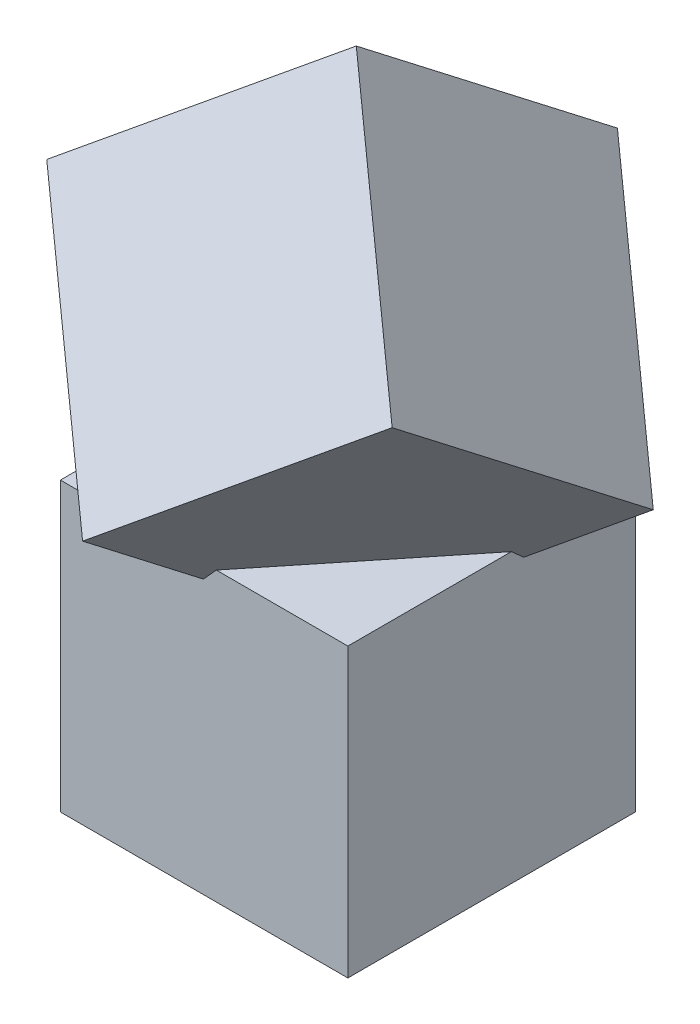
ISO-10303-21;
HEADER;
FILE_DESCRIPTION(('STEP AP214'),'2;1');
FILE_NAME('part.step','',(''),(''),'','','');
FILE_SCHEMA(('AUTOMOTIVE_DESIGN { 1 0 10303 214 1 1 1 1 }'));
ENDSEC;
DATA;
#1=APPLICATION_CONTEXT('core data for automotive mechanical design processes');
#2=APPLICATION_PROTOCOL_DEFINITION('international standard','automotive_design',2000,#1);
#3=PRODUCT_CONTEXT('',#1,'mechanical');
#4=PRODUCT('Part','Part','',(#3));
#5=PRODUCT_RELATED_PRODUCT_CATEGORY('part','',(#4));
#6=PRODUCT_DEFINITION_FORMATION('','',#4);
#7=PRODUCT_DEFINITION_CONTEXT('part definition',#1,'design');
#8=PRODUCT_DEFINITION('design','',#6,#7);
#9=PRODUCT_DEFINITION_SHAPE('','',#8);
#10=(LENGTH_UNIT() NAMED_UNIT(*) SI_UNIT(.MILLI.,.METRE.));
#11=(NAMED_UNIT(*) PLANE_ANGLE_UNIT() SI_UNIT($,.RADIAN.));
#12=(NAMED_UNIT(*) SI_UNIT($,.STERADIAN.) SOLID_ANGLE_UNIT());
#13=UNCERTAINTY_MEASURE_WITH_UNIT(LENGTH_MEASURE(1.E-05),#10,'distance_accuracy_value','');
#14=(GEOMETRIC_REPRESENTATION_CONTEXT(3) GLOBAL_UNCERTAINTY_ASSIGNED_CONTEXT((#13)) GLOBAL_UNIT_ASSIGNED_CONTEXT((#10,
#11,#12)) REPRESENTATION_CONTEXT('',''));
#15=CARTESIAN_POINT('',(0.,0.,0.));
#16=DIRECTION('',(0.,0.,1.));
#17=DIRECTION('',(1.,0.,0.));
#18=AXIS2_PLACEMENT_3D('',#15,#16,#17);
#19=CARTESIAN_POINT('',(-52.6474599966629,137.058153972992,27.1666080296527));
#20=DIRECTION('',(0.762318309311266,0.565679745040778,-0.314447485821422));
#21=DIRECTION('',(0.109672076993213,-0.591737574959713,-0.798635510047476));
#22=AXIS2_PLACEMENT_3D('',#19,#20,#21);
#23=PLANE('',#22);
#24=DIRECTION('',(-0.109672076993213,0.591737574959713,0.798635510047476));
#25=VECTOR('',#24,1.);
#26=CARTESIAN_POINT('',(-4.04387487613971,93.2943327200122,66.2672405407675));
#27=LINE('',#26,#25);
#28=CARTESIAN_POINT('',(4.31313739074309,48.203929508082,5.41121467514981));
#29=VERTEX_POINT('',#28);
#30=CARTESIAN_POINT('',(-4.04387487613971,93.2943327200122,66.2672405407675));
#31=VERTEX_POINT('',#30);
#32=EDGE_CURVE('E116',#29,#31,#27,.T.);
#33=ORIENTED_EDGE('',*,*,#32,.T.);
#34=DIRECTION('',(0.637842324416315,-0.574328362900004,0.51313166025085));
#35=VECTOR('',#34,1.);
#36=CARTESIAN_POINT('',(-52.6474599966629,137.058153972992,27.1666080296527));
#37=LINE('',#36,#35);
#38=CARTESIAN_POINT('',(-52.6474599966629,137.058153972992,27.1666080296527));
#39=VERTEX_POINT('',#38);
#40=EDGE_CURVE('E12',#39,#31,#37,.T.);
#41=ORIENTED_EDGE('',*,*,#40,.F.);
#42=DIRECTION('',(-0.109672076993213,0.591737574959713,0.798635510047476));
#43=VECTOR('',#42,1.);
#44=CARTESIAN_POINT('',(-52.6474599966629,137.058153972992,27.1666080296527));
#45=LINE('',#44,#43);
#46=CARTESIAN_POINT('',(-44.2904477297801,91.9677507610623,-33.689417835965));
#47=VERTEX_POINT('',#46);
#48=EDGE_CURVE('E104',#47,#39,#45,.T.);
#49=ORIENTED_EDGE('',*,*,#48,.F.);
#50=DIRECTION('',(0.637842324416315,-0.574328362900004,0.51313166025085));
#51=VECTOR('',#50,1.);
#52=CARTESIAN_POINT('',(-44.2904477297801,91.9677507610623,-33.689417835965));
#53=LINE('',#52,#51);
#54=EDGE_CURVE('E112',#47,#29,#53,.T.);
#55=ORIENTED_EDGE('',*,*,#54,.T.);
#56=EDGE_LOOP('',(#33,#41,#49,#55));
#57=FACE_BOUND('',#56,.T.);
#58=ADVANCED_FACE('F53',(#57),#23,.F.);
#59=CARTESIAN_POINT('',(-52.6474599966629,137.058153972992,27.1666080296527));
#60=DIRECTION('',(0.109672076993213,-0.591737574959713,-0.798635510047476));
#61=DIRECTION('',(-0.762318309311266,-0.565679745040778,0.314447485821422));
#62=AXIS2_PLACEMENT_3D('',#59,#60,#61);
#63=PLANE('',#62);
#64=DIRECTION('',(0.762318309311266,0.565679745040778,-0.314447485821422));
#65=VECTOR('',#64,1.);
#66=CARTESIAN_POINT('',(-4.04387487613971,93.2943327200122,66.2672405407675));
#67=LINE('',#66,#65);
#68=CARTESIAN_POINT('',(54.0447802933788,136.399129292119,42.3063421211752));
#69=VERTEX_POINT('',#68);
#70=EDGE_CURVE('E108',#31,#69,#67,.T.);
#71=ORIENTED_EDGE('',*,*,#70,.T.);
#72=DIRECTION('',(0.637842324416315,-0.574328362900004,0.51313166025085));
#73=VECTOR('',#72,1.);
#74=CARTESIAN_POINT('',(5.4411951728556,180.1629505451,3.20570961006038));
#75=LINE('',#74,#73);
#76=CARTESIAN_POINT('',(5.4411951728556,180.1629505451,3.20570961006038));
#77=VERTEX_POINT('',#76);
#78=EDGE_CURVE('E61',#77,#69,#75,.T.);
#79=ORIENTED_EDGE('',*,*,#78,.F.);
#80=DIRECTION('',(0.762318309311266,0.565679745040778,-0.314447485821422));
#81=VECTOR('',#80,1.);
#82=CARTESIAN_POINT('',(-52.6474599966629,137.058153972992,27.1666080296527));
#83=LINE('',#82,#81);
#84=EDGE_CURVE('E99',#39,#77,#83,.T.);
#85=ORIENTED_EDGE('',*,*,#84,.F.);
#86=ORIENTED_EDGE('',*,*,#40,.T.);
#87=EDGE_LOOP('',(#71,#79,#85,#86));
#88=FACE_BOUND('',#87,.T.);
#89=ADVANCED_FACE('F107',(#88),#63,.F.);
#90=CARTESIAN_POINT('',(5.4411951728556,180.1629505451,3.20570961006038));
#91=DIRECTION('',(-0.762318309311266,-0.565679745040778,0.314447485821422));
#92=DIRECTION('',(-0.109672076993213,0.591737574959713,0.798635510047476));
#93=AXIS2_PLACEMENT_3D('',#90,#91,#92);
#94=PLANE('',#93);
#95=DIRECTION('',(0.109672076993213,-0.591737574959713,-0.798635510047476));
#96=VECTOR('',#95,1.);
#97=CARTESIAN_POINT('',(54.0447802933788,136.399129292119,42.3063421211752));
#98=LINE('',#97,#96);
#99=CARTESIAN_POINT('',(62.4017925602616,91.3087260801893,-18.5496837444425));
#100=VERTEX_POINT('',#99);
#101=EDGE_CURVE('E86',#69,#100,#98,.T.);
#102=ORIENTED_EDGE('',*,*,#101,.T.);
#103=DIRECTION('',(0.637842324416315,-0.574328362900004,0.51313166025085));
#104=VECTOR('',#103,1.);
#105=CARTESIAN_POINT('',(13.7982074397384,135.07254733317,-57.6503162555573));
#106=LINE('',#105,#104);
#107=CARTESIAN_POINT('',(13.7982074397384,135.07254733317,-57.6503162555573));
#108=VERTEX_POINT('',#107);
#109=EDGE_CURVE('E109',#108,#100,#106,.T.);
#110=ORIENTED_EDGE('',*,*,#109,.F.);
#111=DIRECTION('',(0.109672076993213,-0.591737574959713,-0.798635510047476));
#112=VECTOR('',#111,1.);
#113=CARTESIAN_POINT('',(5.4411951728556,180.1629505451,3.20570961006038));
#114=LINE('',#113,#112);
#115=EDGE_CURVE('E102',#77,#108,#114,.T.);
#116=ORIENTED_EDGE('',*,*,#115,.F.);
#117=ORIENTED_EDGE('',*,*,#78,.T.);
#118=EDGE_LOOP('',(#102,#110,#116,#117));
#119=FACE_BOUND('',#118,.T.);
#120=ADVANCED_FACE('F110',(#119),#94,.F.);
#121=CARTESIAN_POINT('',(-44.2904477297801,91.9677507610623,-33.689417835965));
#122=DIRECTION('',(-0.109672076993213,0.591737574959713,0.798635510047476));
#123=DIRECTION('',(0.762318309311266,0.565679745040778,-0.314447485821422));
#124=AXIS2_PLACEMENT_3D('',#121,#122,#123);
#125=PLANE('',#124);
#126=DIRECTION('',(-0.762318309311266,-0.565679745040778,0.314447485821422));
#127=VECTOR('',#126,1.);
#128=CARTESIAN_POINT('',(4.31313739074309,48.203929508082,5.41121467514981));
#129=LINE('',#128,#127);
#130=EDGE_CURVE('E92',#100,#29,#129,.T.);
#131=ORIENTED_EDGE('',*,*,#130,.T.);
#132=ORIENTED_EDGE('',*,*,#54,.F.);
#133=DIRECTION('',(-0.762318309311266,-0.565679745040778,0.314447485821422));
#134=VECTOR('',#133,1.);
#135=CARTESIAN_POINT('',(-44.2904477297801,91.9677507610623,-33.689417835965));
#136=LINE('',#135,#134);
#137=EDGE_CURVE('E69',#108,#47,#136,.T.);
#138=ORIENTED_EDGE('',*,*,#137,.F.);
#139=ORIENTED_EDGE('',*,*,#109,.T.);
#140=EDGE_LOOP('',(#131,#132,#138,#139));
#141=FACE_BOUND('',#140,.T.);
#142=ADVANCED_FACE('F123',(#141),#125,.F.);
#143=CARTESIAN_POINT('',(-19.4246262784622,136.065350653081,-15.2418541129523));
#144=DIRECTION('',(0.637842324416315,-0.574328362900004,0.51313166025085));
#145=DIRECTION('',(0.109672076993213,-0.591737574959713,-0.798635510047476));
#146=AXIS2_PLACEMENT_3D('',#143,#144,#145);
#147=PLANE('',#146);
#148=ORIENTED_EDGE('',*,*,#48,.T.);
#149=ORIENTED_EDGE('',*,*,#84,.T.);
#150=ORIENTED_EDGE('',*,*,#115,.T.);
#151=ORIENTED_EDGE('',*,*,#137,.T.);
#152=EDGE_LOOP('',(#148,#149,#150,#151));
#153=FACE_BOUND('',#152,.T.);
#154=ADVANCED_FACE('F100',(#153),#147,.F.);
#155=CARTESIAN_POINT('',(29.1789588420609,92.3015294001007,23.8587783981625));
#156=DIRECTION('',(0.637842324416315,-0.574328362900004,0.51313166025085));
#157=DIRECTION('',(0.109672076993213,-0.591737574959713,-0.798635510047476));
#158=AXIS2_PLACEMENT_3D('',#155,#156,#157);
#159=PLANE('',#158);
#160=ORIENTED_EDGE('',*,*,#32,.F.);
#161=ORIENTED_EDGE('',*,*,#130,.F.);
#162=ORIENTED_EDGE('',*,*,#101,.F.);
#163=ORIENTED_EDGE('',*,*,#70,.F.);
#164=EDGE_LOOP('',(#160,#161,#162,#163));
#165=FACE_BOUND('',#164,.T.);
#166=ADVANCED_FACE('F126',(#165),#159,.T.);
#167=CLOSED_SHELL('',(#58,#89,#120,#142,#154,#166));
#168=MANIFOLD_SOLID_BREP('B2',#167);
#169=CARTESIAN_POINT('',(-38.1,76.2,38.1));
#170=DIRECTION('',(1.,0.,0.));
#171=DIRECTION('',(0.,0.,-1.));
#172=AXIS2_PLACEMENT_3D('',#169,#170,#171);
#173=PLANE('',#172);
#174=DIRECTION('',(0.,0.,1.));
#175=VECTOR('',#174,1.);
#176=CARTESIAN_POINT('',(-38.1,0.,38.1));
#177=LINE('',#176,#175);
#178=CARTESIAN_POINT('',(-38.1,0.,-38.1));
#179=VERTEX_POINT('',#178);
#180=CARTESIAN_POINT('',(-38.1,0.,38.1));
#181=VERTEX_POINT('',#180);
#182=EDGE_CURVE('E240',#179,#181,#177,.T.);
#183=ORIENTED_EDGE('',*,*,#182,.T.);
#184=DIRECTION('',(0.,-1.,0.));
#185=VECTOR('',#184,1.);
#186=CARTESIAN_POINT('',(-38.1,76.2,38.1));
#187=LINE('',#186,#185);
#188=CARTESIAN_POINT('',(-38.1,76.2,38.1));
#189=VERTEX_POINT('',#188);
#190=EDGE_CURVE('E51',#189,#181,#187,.T.);
#191=ORIENTED_EDGE('',*,*,#190,.F.);
#192=DIRECTION('',(0.,0.,1.));
#193=VECTOR('',#192,1.);
#194=CARTESIAN_POINT('',(-38.1,76.2,38.1));
#195=LINE('',#194,#193);
#196=CARTESIAN_POINT('',(-38.1,76.2,-38.1));
#197=VERTEX_POINT('',#196);
#198=EDGE_CURVE('E228',#197,#189,#195,.T.);
#199=ORIENTED_EDGE('',*,*,#198,.F.);
#200=DIRECTION('',(0.,-1.,0.));
#201=VECTOR('',#200,1.);
#202=CARTESIAN_POINT('',(-38.1,76.2,-38.1));
#203=LINE('',#202,#201);
#204=EDGE_CURVE('E236',#197,#179,#203,.T.);
#205=ORIENTED_EDGE('',*,*,#204,.T.);
#206=EDGE_LOOP('',(#183,#191,#199,#205));
#207=FACE_BOUND('',#206,.T.);
#208=ADVANCED_FACE('F177',(#207),#173,.F.);
#209=CARTESIAN_POINT('',(-38.1,76.2,38.1));
#210=DIRECTION('',(0.,0.,-1.));
#211=DIRECTION('',(-1.,0.,0.));
#212=AXIS2_PLACEMENT_3D('',#209,#210,#211);
#213=PLANE('',#212);
#214=DIRECTION('',(1.,0.,0.));
#215=VECTOR('',#214,1.);
#216=CARTESIAN_POINT('',(-38.1,0.,38.1));
#217=LINE('',#216,#215);
#218=CARTESIAN_POINT('',(38.1,0.,38.1));
#219=VERTEX_POINT('',#218);
#220=EDGE_CURVE('E232',#181,#219,#217,.T.);
#221=ORIENTED_EDGE('',*,*,#220,.T.);
#222=DIRECTION('',(0.,-1.,0.));
#223=VECTOR('',#222,1.);
#224=CARTESIAN_POINT('',(38.1,76.2,38.1));
#225=LINE('',#224,#223);
#226=CARTESIAN_POINT('',(38.1,76.2,38.1));
#227=VERTEX_POINT('',#226);
#228=EDGE_CURVE('E185',#227,#219,#225,.T.);
#229=ORIENTED_EDGE('',*,*,#228,.F.);
#230=DIRECTION('',(1.,0.,0.));
#231=VECTOR('',#230,1.);
#232=CARTESIAN_POINT('',(-38.1,76.2,38.1));
#233=LINE('',#232,#231);
#234=EDGE_CURVE('E223',#189,#227,#233,.T.);
#235=ORIENTED_EDGE('',*,*,#234,.F.);
#236=ORIENTED_EDGE('',*,*,#190,.T.);
#237=EDGE_LOOP('',(#221,#229,#235,#236));
#238=FACE_BOUND('',#237,.T.);
#239=ADVANCED_FACE('F231',(#238),#213,.F.);
#240=CARTESIAN_POINT('',(38.1,76.2,38.1));
#241=DIRECTION('',(-1.,0.,0.));
#242=DIRECTION('',(0.,0.,1.));
#243=AXIS2_PLACEMENT_3D('',#240,#241,#242);
#244=PLANE('',#243);
#245=DIRECTION('',(0.,0.,-1.));
#246=VECTOR('',#245,1.);
#247=CARTESIAN_POINT('',(38.1,0.,38.1));
#248=LINE('',#247,#246);
#249=CARTESIAN_POINT('',(38.1,0.,-38.1));
#250=VERTEX_POINT('',#249);
#251=EDGE_CURVE('E210',#219,#250,#248,.T.);
#252=ORIENTED_EDGE('',*,*,#251,.T.);
#253=DIRECTION('',(0.,-1.,0.));
#254=VECTOR('',#253,1.);
#255=CARTESIAN_POINT('',(38.1,76.2,-38.1));
#256=LINE('',#255,#254);
#257=CARTESIAN_POINT('',(38.1,76.2,-38.1));
#258=VERTEX_POINT('',#257);
#259=EDGE_CURVE('E233',#258,#250,#256,.T.);
#260=ORIENTED_EDGE('',*,*,#259,.F.);
#261=DIRECTION('',(0.,0.,-1.));
#262=VECTOR('',#261,1.);
#263=CARTESIAN_POINT('',(38.1,76.2,38.1));
#264=LINE('',#263,#262);
#265=EDGE_CURVE('E226',#227,#258,#264,.T.);
#266=ORIENTED_EDGE('',*,*,#265,.F.);
#267=ORIENTED_EDGE('',*,*,#228,.T.);
#268=EDGE_LOOP('',(#252,#260,#266,#267));
#269=FACE_BOUND('',#268,.T.);
#270=ADVANCED_FACE('F234',(#269),#244,.F.);
#271=CARTESIAN_POINT('',(-38.1,76.2,-38.1));
#272=DIRECTION('',(0.,0.,1.));
#273=DIRECTION('',(1.,0.,0.));
#274=AXIS2_PLACEMENT_3D('',#271,#272,#273);
#275=PLANE('',#274);
#276=DIRECTION('',(-1.,0.,0.));
#277=VECTOR('',#276,1.);
#278=CARTESIAN_POINT('',(-38.1,0.,-38.1));
#279=LINE('',#278,#277);
#280=EDGE_CURVE('E216',#250,#179,#279,.T.);
#281=ORIENTED_EDGE('',*,*,#280,.T.);
#282=ORIENTED_EDGE('',*,*,#204,.F.);
#283=DIRECTION('',(-1.,0.,0.));
#284=VECTOR('',#283,1.);
#285=CARTESIAN_POINT('',(-38.1,76.2,-38.1));
#286=LINE('',#285,#284);
#287=EDGE_CURVE('E193',#258,#197,#286,.T.);
#288=ORIENTED_EDGE('',*,*,#287,.F.);
#289=ORIENTED_EDGE('',*,*,#259,.T.);
#290=EDGE_LOOP('',(#281,#282,#288,#289));
#291=FACE_BOUND('',#290,.T.);
#292=ADVANCED_FACE('F247',(#291),#275,.F.);
#293=CARTESIAN_POINT('',(0.,76.2,0.));
#294=DIRECTION('',(0.,-1.,0.));
#295=DIRECTION('',(0.,0.,-1.));
#296=AXIS2_PLACEMENT_3D('',#293,#294,#295);
#297=PLANE('',#296);
#298=ORIENTED_EDGE('',*,*,#198,.T.);
#299=ORIENTED_EDGE('',*,*,#234,.T.);
#300=ORIENTED_EDGE('',*,*,#265,.T.);
#301=ORIENTED_EDGE('',*,*,#287,.T.);
#302=EDGE_LOOP('',(#298,#299,#300,#301));
#303=FACE_BOUND('',#302,.T.);
#304=ADVANCED_FACE('F224',(#303),#297,.F.);
#305=CARTESIAN_POINT('',(0.,0.,0.));
#306=DIRECTION('',(0.,-1.,0.));
#307=DIRECTION('',(0.,0.,-1.));
#308=AXIS2_PLACEMENT_3D('',#305,#306,#307);
#309=PLANE('',#308);
#310=ORIENTED_EDGE('',*,*,#182,.F.);
#311=ORIENTED_EDGE('',*,*,#280,.F.);
#312=ORIENTED_EDGE('',*,*,#251,.F.);
#313=ORIENTED_EDGE('',*,*,#220,.F.);
#314=EDGE_LOOP('',(#310,#311,#312,#313));
#315=FACE_BOUND('',#314,.T.);
#316=ADVANCED_FACE('F250',(#315),#309,.T.);
#317=CLOSED_SHELL('',(#208,#239,#270,#292,#304,#316));
#318=MANIFOLD_SOLID_BREP('B6',#317);
#319=ADVANCED_BREP_SHAPE_REPRESENTATION('',(#18,#168,#318),#14);
#320=SHAPE_DEFINITION_REPRESENTATION(#9,#319);
ENDSEC;
END-ISO-10303-21;
